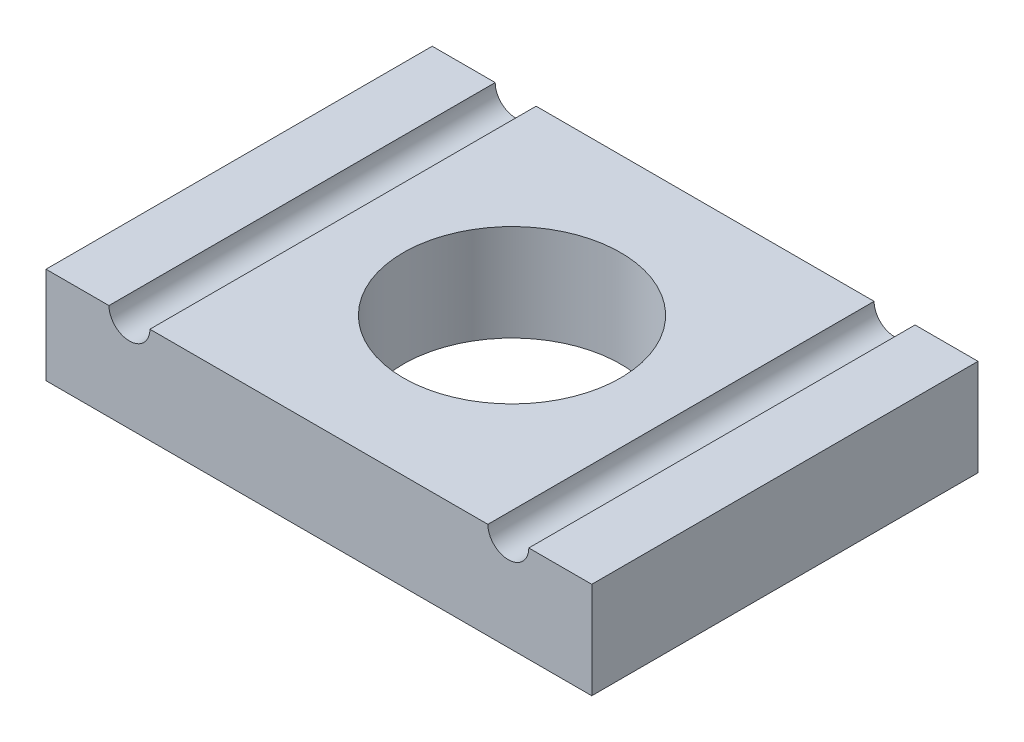
ISO-10303-21;
HEADER;
FILE_DESCRIPTION(('STEP AP214'),'2;1');
FILE_NAME('part.step','',(''),(''),'','','');
FILE_SCHEMA(('AUTOMOTIVE_DESIGN { 1 0 10303 214 1 1 1 1 }'));
ENDSEC;
DATA;
#1=APPLICATION_CONTEXT('core data for automotive mechanical design processes');
#2=APPLICATION_PROTOCOL_DEFINITION('international standard','automotive_design',2000,#1);
#3=PRODUCT_CONTEXT('',#1,'mechanical');
#4=PRODUCT('Part','Part','',(#3));
#5=PRODUCT_RELATED_PRODUCT_CATEGORY('part','',(#4));
#6=PRODUCT_DEFINITION_FORMATION('','',#4);
#7=PRODUCT_DEFINITION_CONTEXT('part definition',#1,'design');
#8=PRODUCT_DEFINITION('design','',#6,#7);
#9=PRODUCT_DEFINITION_SHAPE('','',#8);
#10=(LENGTH_UNIT() NAMED_UNIT(*) SI_UNIT(.MILLI.,.METRE.));
#11=(NAMED_UNIT(*) PLANE_ANGLE_UNIT() SI_UNIT($,.RADIAN.));
#12=(NAMED_UNIT(*) SI_UNIT($,.STERADIAN.) SOLID_ANGLE_UNIT());
#13=UNCERTAINTY_MEASURE_WITH_UNIT(LENGTH_MEASURE(1.E-05),#10,'distance_accuracy_value','');
#14=(GEOMETRIC_REPRESENTATION_CONTEXT(3) GLOBAL_UNCERTAINTY_ASSIGNED_CONTEXT((#13)) GLOBAL_UNIT_ASSIGNED_CONTEXT((#10,
#11,#12)) REPRESENTATION_CONTEXT('',''));
#15=CARTESIAN_POINT('',(0.,0.,0.));
#16=DIRECTION('',(0.,0.,1.));
#17=DIRECTION('',(1.,0.,0.));
#18=AXIS2_PLACEMENT_3D('',#15,#16,#17);
#19=CARTESIAN_POINT('',(0.,6.35,0.));
#20=DIRECTION('',(0.,1.,0.));
#21=DIRECTION('',(0.,0.,1.));
#22=AXIS2_PLACEMENT_3D('',#19,#20,#21);
#23=PLANE('',#22);
#24=DIRECTION('',(0.,0.,1.));
#25=VECTOR('',#24,1.);
#26=CARTESIAN_POINT('',(11.1125,6.35,-12.7));
#27=LINE('',#26,#25);
#28=CARTESIAN_POINT('',(11.1125,6.35,-12.7));
#29=VERTEX_POINT('',#28);
#30=CARTESIAN_POINT('',(11.1125,6.35,12.7));
#31=VERTEX_POINT('',#30);
#32=EDGE_CURVE('E99',#29,#31,#27,.T.);
#33=ORIENTED_EDGE('',*,*,#32,.F.);
#34=DIRECTION('',(-1.,0.,0.));
#35=VECTOR('',#34,1.);
#36=CARTESIAN_POINT('',(-17.9451,6.35,-12.7));
#37=LINE('',#36,#35);
#38=CARTESIAN_POINT('',(-11.1125,6.35,-12.7));
#39=VERTEX_POINT('',#38);
#40=EDGE_CURVE('E57',#29,#39,#37,.T.);
#41=ORIENTED_EDGE('',*,*,#40,.T.);
#42=DIRECTION('',(0.,0.,1.));
#43=VECTOR('',#42,1.);
#44=CARTESIAN_POINT('',(-11.1125,6.35,-12.7));
#45=LINE('',#44,#43);
#46=CARTESIAN_POINT('',(-11.1125,6.35,12.7));
#47=VERTEX_POINT('',#46);
#48=EDGE_CURVE('E178',#47,#39,#45,.F.);
#49=ORIENTED_EDGE('',*,*,#48,.F.);
#50=DIRECTION('',(1.,0.,0.));
#51=VECTOR('',#50,1.);
#52=CARTESIAN_POINT('',(-17.9451,6.35,12.7));
#53=LINE('',#52,#51);
#54=EDGE_CURVE('E107',#47,#31,#53,.T.);
#55=ORIENTED_EDGE('',*,*,#54,.T.);
#56=EDGE_LOOP('',(#33,#41,#49,#55));
#57=FACE_BOUND('',#56,.T.);
#58=CARTESIAN_POINT('',(0.,6.35,0.));
#59=DIRECTION('',(0.,1.,0.));
#60=DIRECTION('',(0.,0.,1.));
#61=AXIS2_PLACEMENT_3D('',#58,#59,#60);
#62=CIRCLE('',#61,7.14375);
#63=CARTESIAN_POINT('',(0.,6.35,7.14375));
#64=VERTEX_POINT('',#63);
#65=EDGE_CURVE('E125',#64,#64,#62,.T.);
#66=ORIENTED_EDGE('',*,*,#65,.F.);
#67=EDGE_LOOP('',(#66));
#68=FACE_BOUND('',#67,.T.);
#69=ADVANCED_FACE('F35',(#57,#68),#23,.T.);
#70=DIRECTION('',(0.,0.,1.));
#71=VECTOR('',#70,1.);
#72=CARTESIAN_POINT('',(-13.8049,6.35,-12.7));
#73=LINE('',#72,#71);
#74=CARTESIAN_POINT('',(-13.8049,6.35,-12.7));
#75=VERTEX_POINT('',#74);
#76=CARTESIAN_POINT('',(-13.8049,6.35,12.7));
#77=VERTEX_POINT('',#76);
#78=EDGE_CURVE('E174',#75,#77,#73,.T.);
#79=ORIENTED_EDGE('',*,*,#78,.F.);
#80=CARTESIAN_POINT('',(-17.9451,6.35,-12.7));
#81=VERTEX_POINT('',#80);
#82=EDGE_CURVE('E114',#75,#81,#37,.T.);
#83=ORIENTED_EDGE('',*,*,#82,.T.);
#84=DIRECTION('',(0.,0.,1.));
#85=VECTOR('',#84,1.);
#86=CARTESIAN_POINT('',(-17.9451,6.35,-12.7));
#87=LINE('',#86,#85);
#88=CARTESIAN_POINT('',(-17.9451,6.35,12.7));
#89=VERTEX_POINT('',#88);
#90=EDGE_CURVE('E131',#81,#89,#87,.T.);
#91=ORIENTED_EDGE('',*,*,#90,.T.);
#92=EDGE_CURVE('E149',#89,#77,#53,.T.);
#93=ORIENTED_EDGE('',*,*,#92,.T.);
#94=EDGE_LOOP('',(#79,#83,#91,#93));
#95=FACE_BOUND('',#94,.T.);
#96=ADVANCED_FACE('F185',(#95),#23,.T.);
#97=DIRECTION('',(0.,0.,1.));
#98=VECTOR('',#97,1.);
#99=CARTESIAN_POINT('',(13.8049,6.35,-12.7));
#100=LINE('',#99,#98);
#101=CARTESIAN_POINT('',(13.8049,6.35,12.7));
#102=VERTEX_POINT('',#101);
#103=CARTESIAN_POINT('',(13.8049,6.35,-12.7));
#104=VERTEX_POINT('',#103);
#105=EDGE_CURVE('E50',#102,#104,#100,.F.);
#106=ORIENTED_EDGE('',*,*,#105,.F.);
#107=CARTESIAN_POINT('',(17.9451,6.35,12.7));
#108=VERTEX_POINT('',#107);
#109=EDGE_CURVE('E166',#102,#108,#53,.T.);
#110=ORIENTED_EDGE('',*,*,#109,.T.);
#111=DIRECTION('',(0.,0.,-1.));
#112=VECTOR('',#111,1.);
#113=CARTESIAN_POINT('',(17.9451,6.35,-12.7));
#114=LINE('',#113,#112);
#115=CARTESIAN_POINT('',(17.9451,6.35,-12.7));
#116=VERTEX_POINT('',#115);
#117=EDGE_CURVE('E117',#108,#116,#114,.T.);
#118=ORIENTED_EDGE('',*,*,#117,.T.);
#119=EDGE_CURVE('E113',#116,#104,#37,.T.);
#120=ORIENTED_EDGE('',*,*,#119,.T.);
#121=EDGE_LOOP('',(#106,#110,#118,#120));
#122=FACE_BOUND('',#121,.T.);
#123=ADVANCED_FACE('F165',(#122),#23,.T.);
#124=CARTESIAN_POINT('',(0.,0.,0.));
#125=DIRECTION('',(0.,1.,0.));
#126=DIRECTION('',(0.,0.,1.));
#127=AXIS2_PLACEMENT_3D('',#124,#125,#126);
#128=PLANE('',#127);
#129=DIRECTION('',(0.,0.,1.));
#130=VECTOR('',#129,1.);
#131=CARTESIAN_POINT('',(-17.9451,0.,-12.7));
#132=LINE('',#131,#130);
#133=CARTESIAN_POINT('',(-17.9451,0.,-12.7));
#134=VERTEX_POINT('',#133);
#135=CARTESIAN_POINT('',(-17.9451,0.,12.7));
#136=VERTEX_POINT('',#135);
#137=EDGE_CURVE('E121',#134,#136,#132,.T.);
#138=ORIENTED_EDGE('',*,*,#137,.F.);
#139=DIRECTION('',(-1.,0.,0.));
#140=VECTOR('',#139,1.);
#141=CARTESIAN_POINT('',(-17.9451,0.,-12.7));
#142=LINE('',#141,#140);
#143=CARTESIAN_POINT('',(17.9451,0.,-12.7));
#144=VERTEX_POINT('',#143);
#145=EDGE_CURVE('E129',#144,#134,#142,.T.);
#146=ORIENTED_EDGE('',*,*,#145,.F.);
#147=DIRECTION('',(0.,0.,-1.));
#148=VECTOR('',#147,1.);
#149=CARTESIAN_POINT('',(17.9451,0.,-12.7));
#150=LINE('',#149,#148);
#151=CARTESIAN_POINT('',(17.9451,0.,12.7));
#152=VERTEX_POINT('',#151);
#153=EDGE_CURVE('E127',#152,#144,#150,.T.);
#154=ORIENTED_EDGE('',*,*,#153,.F.);
#155=DIRECTION('',(1.,0.,0.));
#156=VECTOR('',#155,1.);
#157=CARTESIAN_POINT('',(-17.9451,0.,12.7));
#158=LINE('',#157,#156);
#159=EDGE_CURVE('E124',#136,#152,#158,.T.);
#160=ORIENTED_EDGE('',*,*,#159,.F.);
#161=EDGE_LOOP('',(#138,#146,#154,#160));
#162=FACE_BOUND('',#161,.T.);
#163=CARTESIAN_POINT('',(0.,0.,0.));
#164=DIRECTION('',(0.,1.,0.));
#165=DIRECTION('',(0.,0.,1.));
#166=AXIS2_PLACEMENT_3D('',#163,#164,#165);
#167=CIRCLE('',#166,7.14375);
#168=CARTESIAN_POINT('',(0.,0.,7.14375));
#169=VERTEX_POINT('',#168);
#170=EDGE_CURVE('E171',#169,#169,#167,.T.);
#171=ORIENTED_EDGE('',*,*,#170,.T.);
#172=EDGE_LOOP('',(#171));
#173=FACE_BOUND('',#172,.T.);
#174=ADVANCED_FACE('F157',(#162,#173),#128,.F.);
#175=CARTESIAN_POINT('',(-17.9451,6.35,-12.7));
#176=DIRECTION('',(1.,0.,0.));
#177=DIRECTION('',(0.,0.,-1.));
#178=AXIS2_PLACEMENT_3D('',#175,#176,#177);
#179=PLANE('',#178);
#180=ORIENTED_EDGE('',*,*,#137,.T.);
#181=DIRECTION('',(0.,-1.,0.));
#182=VECTOR('',#181,1.);
#183=CARTESIAN_POINT('',(-17.9451,6.35,12.7));
#184=LINE('',#183,#182);
#185=EDGE_CURVE('E140',#89,#136,#184,.T.);
#186=ORIENTED_EDGE('',*,*,#185,.F.);
#187=ORIENTED_EDGE('',*,*,#90,.F.);
#188=DIRECTION('',(0.,-1.,0.));
#189=VECTOR('',#188,1.);
#190=CARTESIAN_POINT('',(-17.9451,6.35,-12.7));
#191=LINE('',#190,#189);
#192=EDGE_CURVE('E116',#81,#134,#191,.T.);
#193=ORIENTED_EDGE('',*,*,#192,.T.);
#194=EDGE_LOOP('',(#180,#186,#187,#193));
#195=FACE_BOUND('',#194,.T.);
#196=ADVANCED_FACE('F37',(#195),#179,.F.);
#197=CARTESIAN_POINT('',(-17.9451,6.35,12.7));
#198=DIRECTION('',(0.,0.,-1.));
#199=DIRECTION('',(-1.,0.,0.));
#200=AXIS2_PLACEMENT_3D('',#197,#198,#199);
#201=PLANE('',#200);
#202=ORIENTED_EDGE('',*,*,#109,.F.);
#203=CARTESIAN_POINT('',(12.4587,6.35,12.7));
#204=DIRECTION('',(0.,0.,1.));
#205=DIRECTION('',(1.,0.,0.));
#206=AXIS2_PLACEMENT_3D('',#203,#204,#205);
#207=CIRCLE('',#206,1.3462);
#208=EDGE_CURVE('E182',#31,#102,#207,.T.);
#209=ORIENTED_EDGE('',*,*,#208,.F.);
#210=ORIENTED_EDGE('',*,*,#54,.F.);
#211=CARTESIAN_POINT('',(-12.4587,6.35,12.7));
#212=DIRECTION('',(0.,0.,1.));
#213=DIRECTION('',(1.,0.,0.));
#214=AXIS2_PLACEMENT_3D('',#211,#212,#213);
#215=CIRCLE('',#214,1.3462);
#216=EDGE_CURVE('E108',#77,#47,#215,.T.);
#217=ORIENTED_EDGE('',*,*,#216,.F.);
#218=ORIENTED_EDGE('',*,*,#92,.F.);
#219=ORIENTED_EDGE('',*,*,#185,.T.);
#220=ORIENTED_EDGE('',*,*,#159,.T.);
#221=DIRECTION('',(0.,-1.,0.));
#222=VECTOR('',#221,1.);
#223=CARTESIAN_POINT('',(17.9451,6.35,12.7));
#224=LINE('',#223,#222);
#225=EDGE_CURVE('E137',#108,#152,#224,.T.);
#226=ORIENTED_EDGE('',*,*,#225,.F.);
#227=EDGE_LOOP('',(#202,#209,#210,#217,#218,#219,#220,#226));
#228=FACE_BOUND('',#227,.T.);
#229=ADVANCED_FACE('F145',(#228),#201,.F.);
#230=CARTESIAN_POINT('',(17.9451,6.35,-12.7));
#231=DIRECTION('',(-1.,0.,0.));
#232=DIRECTION('',(0.,0.,1.));
#233=AXIS2_PLACEMENT_3D('',#230,#231,#232);
#234=PLANE('',#233);
#235=ORIENTED_EDGE('',*,*,#153,.T.);
#236=DIRECTION('',(0.,-1.,0.));
#237=VECTOR('',#236,1.);
#238=CARTESIAN_POINT('',(17.9451,6.35,-12.7));
#239=LINE('',#238,#237);
#240=EDGE_CURVE('E134',#116,#144,#239,.T.);
#241=ORIENTED_EDGE('',*,*,#240,.F.);
#242=ORIENTED_EDGE('',*,*,#117,.F.);
#243=ORIENTED_EDGE('',*,*,#225,.T.);
#244=EDGE_LOOP('',(#235,#241,#242,#243));
#245=FACE_BOUND('',#244,.T.);
#246=ADVANCED_FACE('F162',(#245),#234,.F.);
#247=CARTESIAN_POINT('',(-17.9451,6.35,-12.7));
#248=DIRECTION('',(0.,0.,1.));
#249=DIRECTION('',(1.,0.,0.));
#250=AXIS2_PLACEMENT_3D('',#247,#248,#249);
#251=PLANE('',#250);
#252=ORIENTED_EDGE('',*,*,#40,.F.);
#253=CARTESIAN_POINT('',(12.4587,6.35,-12.7));
#254=DIRECTION('',(0.,0.,1.));
#255=DIRECTION('',(1.,0.,0.));
#256=AXIS2_PLACEMENT_3D('',#253,#254,#255);
#257=CIRCLE('',#256,1.3462);
#258=EDGE_CURVE('E11',#29,#104,#257,.T.);
#259=ORIENTED_EDGE('',*,*,#258,.T.);
#260=ORIENTED_EDGE('',*,*,#119,.F.);
#261=ORIENTED_EDGE('',*,*,#240,.T.);
#262=ORIENTED_EDGE('',*,*,#145,.T.);
#263=ORIENTED_EDGE('',*,*,#192,.F.);
#264=ORIENTED_EDGE('',*,*,#82,.F.);
#265=CARTESIAN_POINT('',(-12.4587,6.35,-12.7));
#266=DIRECTION('',(0.,0.,1.));
#267=DIRECTION('',(1.,0.,0.));
#268=AXIS2_PLACEMENT_3D('',#265,#266,#267);
#269=CIRCLE('',#268,1.3462);
#270=EDGE_CURVE('E43',#75,#39,#269,.T.);
#271=ORIENTED_EDGE('',*,*,#270,.T.);
#272=EDGE_LOOP('',(#252,#259,#260,#261,#262,#263,#264,#271));
#273=FACE_BOUND('',#272,.T.);
#274=ADVANCED_FACE('F111',(#273),#251,.F.);
#275=CARTESIAN_POINT('',(0.,6.35,0.));
#276=DIRECTION('',(0.,-1.,0.));
#277=DIRECTION('',(0.,0.,-1.));
#278=AXIS2_PLACEMENT_3D('',#275,#276,#277);
#279=CYLINDRICAL_SURFACE('',#278,7.14375);
#280=ORIENTED_EDGE('',*,*,#65,.T.);
#281=EDGE_LOOP('',(#280));
#282=FACE_BOUND('',#281,.T.);
#283=ORIENTED_EDGE('',*,*,#170,.F.);
#284=EDGE_LOOP('',(#283));
#285=FACE_BOUND('',#284,.T.);
#286=ADVANCED_FACE('F194',(#282,#285),#279,.F.);
#287=CARTESIAN_POINT('',(-12.4587,6.35,-12.7));
#288=DIRECTION('',(0.,0.,1.));
#289=DIRECTION('',(1.,0.,0.));
#290=AXIS2_PLACEMENT_3D('',#287,#288,#289);
#291=CYLINDRICAL_SURFACE('',#290,1.3462);
#292=ORIENTED_EDGE('',*,*,#78,.T.);
#293=ORIENTED_EDGE('',*,*,#216,.T.);
#294=ORIENTED_EDGE('',*,*,#48,.T.);
#295=ORIENTED_EDGE('',*,*,#270,.F.);
#296=EDGE_LOOP('',(#292,#293,#294,#295));
#297=FACE_BOUND('',#296,.T.);
#298=ADVANCED_FACE('F184',(#297),#291,.F.);
#299=CARTESIAN_POINT('',(12.4587,6.35,-12.7));
#300=DIRECTION('',(0.,0.,1.));
#301=DIRECTION('',(1.,0.,0.));
#302=AXIS2_PLACEMENT_3D('',#299,#300,#301);
#303=CYLINDRICAL_SURFACE('',#302,1.3462);
#304=ORIENTED_EDGE('',*,*,#32,.T.);
#305=ORIENTED_EDGE('',*,*,#208,.T.);
#306=ORIENTED_EDGE('',*,*,#105,.T.);
#307=ORIENTED_EDGE('',*,*,#258,.F.);
#308=EDGE_LOOP('',(#304,#305,#306,#307));
#309=FACE_BOUND('',#308,.T.);
#310=ADVANCED_FACE('F98',(#309),#303,.F.);
#311=CLOSED_SHELL('',(#69,#96,#123,#174,#196,#229,#246,#274,#286,#298,#310));
#312=MANIFOLD_SOLID_BREP('B2',#311);
#313=ADVANCED_BREP_SHAPE_REPRESENTATION('',(#18,#312),#14);
#314=SHAPE_DEFINITION_REPRESENTATION(#9,#313);
ENDSEC;
END-ISO-10303-21;
